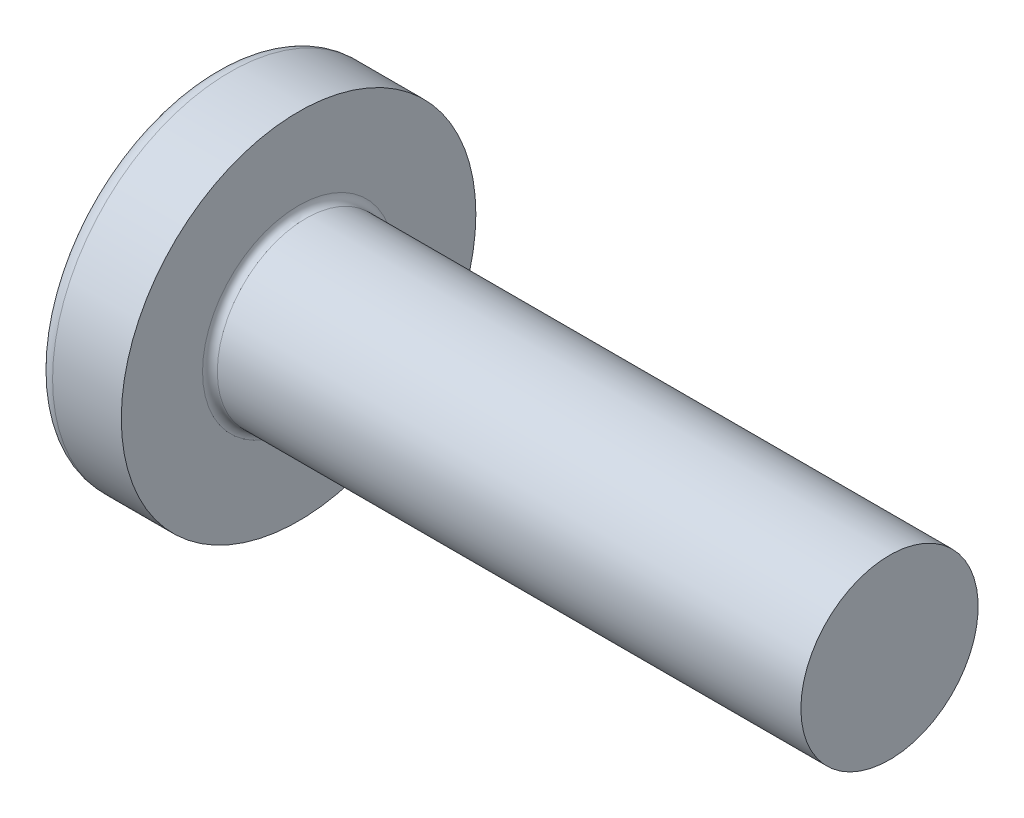
ISO-10303-21;
HEADER;
FILE_DESCRIPTION(('STEP AP214'),'2;1');
FILE_NAME('part.step','',(''),(''),'','','');
FILE_SCHEMA(('AUTOMOTIVE_DESIGN { 1 0 10303 214 1 1 1 1 }'));
ENDSEC;
DATA;
#1=APPLICATION_CONTEXT('core data for automotive mechanical design processes');
#2=APPLICATION_PROTOCOL_DEFINITION('international standard','automotive_design',2000,#1);
#3=PRODUCT_CONTEXT('',#1,'mechanical');
#4=PRODUCT('Part','Part','',(#3));
#5=PRODUCT_RELATED_PRODUCT_CATEGORY('part','',(#4));
#6=PRODUCT_DEFINITION_FORMATION('','',#4);
#7=PRODUCT_DEFINITION_CONTEXT('part definition',#1,'design');
#8=PRODUCT_DEFINITION('design','',#6,#7);
#9=PRODUCT_DEFINITION_SHAPE('','',#8);
#10=(LENGTH_UNIT() NAMED_UNIT(*) SI_UNIT(.MILLI.,.METRE.));
#11=(NAMED_UNIT(*) PLANE_ANGLE_UNIT() SI_UNIT($,.RADIAN.));
#12=(NAMED_UNIT(*) SI_UNIT($,.STERADIAN.) SOLID_ANGLE_UNIT());
#13=UNCERTAINTY_MEASURE_WITH_UNIT(LENGTH_MEASURE(1.E-05),#10,'distance_accuracy_value','');
#14=(GEOMETRIC_REPRESENTATION_CONTEXT(3) GLOBAL_UNCERTAINTY_ASSIGNED_CONTEXT((#13)) GLOBAL_UNIT_ASSIGNED_CONTEXT((#10,
#11,#12)) REPRESENTATION_CONTEXT('',''));
#15=CARTESIAN_POINT('',(0.,0.,0.));
#16=DIRECTION('',(0.,0.,1.));
#17=DIRECTION('',(1.,0.,0.));
#18=AXIS2_PLACEMENT_3D('',#15,#16,#17);
#19=CARTESIAN_POINT('',(10.,0.,0.));
#20=DIRECTION('',(-1.,0.,0.));
#21=DIRECTION('',(0.,1.,0.));
#22=AXIS2_PLACEMENT_3D('',#19,#20,#21);
#23=SPHERICAL_SURFACE('',#22,10.);
#24=CARTESIAN_POINT('',(1.83373872480847,0.,0.));
#25=DIRECTION('',(-1.,0.,0.));
#26=DIRECTION('',(0.,0.,1.));
#27=AXIS2_PLACEMENT_3D('',#24,#25,#26);
#28=CIRCLE('',#27,5.77167019027484);
#29=CARTESIAN_POINT('',(1.83373872480847,0.,5.77167019027484));
#30=VERTEX_POINT('',#29);
#31=EDGE_CURVE('E213',#30,#30,#28,.T.);
#32=ORIENTED_EDGE('',*,*,#31,.T.);
#33=EDGE_LOOP('',(#32));
#34=FACE_BOUND('',#33,.T.);
#35=CARTESIAN_POINT('',(0.11533271177369,0.,0.));
#36=DIRECTION('',(1.,0.,0.));
#37=DIRECTION('',(0.,0.,-1.));
#38=AXIS2_PLACEMENT_3D('',#35,#36,#37);
#39=CIRCLE('',#38,1.51438192047739);
#40=CARTESIAN_POINT('',(0.115332711773695,-0.709999999999995,-1.33762947076864));
#41=VERTEX_POINT('',#40);
#42=CARTESIAN_POINT('',(0.11533271177369,-1.33762947076862,-0.71));
#43=VERTEX_POINT('',#42);
#44=EDGE_CURVE('E339',#41,#43,#39,.F.);
#45=ORIENTED_EDGE('',*,*,#44,.F.);
#46=CARTESIAN_POINT('',(10.,-0.71,0.));
#47=DIRECTION('',(0.,1.,0.));
#48=DIRECTION('',(0.,0.,1.));
#49=AXIS2_PLACEMENT_3D('',#46,#47,#48);
#50=CIRCLE('',#49,9.97476315508293);
#51=CARTESIAN_POINT('',(0.516695966128057,-0.709999999999989,-3.09238493741451));
#52=VERTEX_POINT('',#51);
#53=EDGE_CURVE('E273',#52,#41,#50,.T.);
#54=ORIENTED_EDGE('',*,*,#53,.F.);
#55=CARTESIAN_POINT('',(9.3467899937754,0.,1.3101368059126));
#56=DIRECTION('',(0.446197753347436,0.,-0.894934391398443));
#57=DIRECTION('',(-0.894934391398443,0.,-0.446197753347436));
#58=AXIS2_PLACEMENT_3D('',#55,#56,#57);
#59=CIRCLE('',#58,9.89226254390578);
#60=CARTESIAN_POINT('',(0.516695966128057,0.710000000000011,-3.0923849374145));
#61=VERTEX_POINT('',#60);
#62=EDGE_CURVE('E247',#52,#61,#59,.T.);
#63=ORIENTED_EDGE('',*,*,#62,.T.);
#64=CARTESIAN_POINT('',(10.,0.71,0.));
#65=DIRECTION('',(0.,-1.,0.));
#66=DIRECTION('',(0.,0.,-1.));
#67=AXIS2_PLACEMENT_3D('',#64,#65,#66);
#68=CIRCLE('',#67,9.97476315508293);
#69=CARTESIAN_POINT('',(0.115332711773694,0.710000000000005,-1.33762947076863));
#70=VERTEX_POINT('',#69);
#71=EDGE_CURVE('E301',#70,#61,#68,.T.);
#72=ORIENTED_EDGE('',*,*,#71,.F.);
#73=CARTESIAN_POINT('',(0.11533271177369,1.33762947076862,-0.71));
#74=VERTEX_POINT('',#73);
#75=EDGE_CURVE('E354',#74,#70,#39,.F.);
#76=ORIENTED_EDGE('',*,*,#75,.F.);
#77=CARTESIAN_POINT('',(10.,0.,-0.71));
#78=DIRECTION('',(0.,0.,1.));
#79=DIRECTION('',(1.,0.,0.));
#80=AXIS2_PLACEMENT_3D('',#77,#78,#79);
#81=CIRCLE('',#80,9.97476315508293);
#82=CARTESIAN_POINT('',(0.516695966128057,3.09238493741451,-0.71));
#83=VERTEX_POINT('',#82);
#84=EDGE_CURVE('E241',#83,#74,#81,.T.);
#85=ORIENTED_EDGE('',*,*,#84,.F.);
#86=CARTESIAN_POINT('',(9.3467899937754,-1.3101368059126,0.));
#87=DIRECTION('',(0.446197753347436,0.894934391398443,0.));
#88=DIRECTION('',(-0.894934391398443,0.446197753347436,0.));
#89=AXIS2_PLACEMENT_3D('',#86,#87,#88);
#90=CIRCLE('',#89,9.89226254390578);
#91=CARTESIAN_POINT('',(0.516695966128057,3.09238493741451,0.71));
#92=VERTEX_POINT('',#91);
#93=EDGE_CURVE('E244',#83,#92,#90,.T.);
#94=ORIENTED_EDGE('',*,*,#93,.T.);
#95=CARTESIAN_POINT('',(10.,0.,0.71));
#96=DIRECTION('',(0.,0.,-1.));
#97=DIRECTION('',(0.,1.,0.));
#98=AXIS2_PLACEMENT_3D('',#95,#96,#97);
#99=CIRCLE('',#98,9.97476315508293);
#100=CARTESIAN_POINT('',(0.11533271177369,1.33762947076862,0.71));
#101=VERTEX_POINT('',#100);
#102=EDGE_CURVE('E237',#101,#92,#99,.T.);
#103=ORIENTED_EDGE('',*,*,#102,.F.);
#104=CARTESIAN_POINT('',(0.115332711773695,0.709999999999995,1.33762947076864));
#105=VERTEX_POINT('',#104);
#106=EDGE_CURVE('E353',#105,#101,#39,.F.);
#107=ORIENTED_EDGE('',*,*,#106,.F.);
#108=CARTESIAN_POINT('',(0.516695966128057,0.709999999999989,3.09238493741451));
#109=VERTEX_POINT('',#108);
#110=EDGE_CURVE('E257',#109,#105,#68,.T.);
#111=ORIENTED_EDGE('',*,*,#110,.F.);
#112=CARTESIAN_POINT('',(9.3467899937754,0.,-1.3101368059126));
#113=DIRECTION('',(0.446197753347436,0.,0.894934391398443));
#114=DIRECTION('',(0.894934391398443,0.,-0.446197753347436));
#115=AXIS2_PLACEMENT_3D('',#112,#113,#114);
#116=CIRCLE('',#115,9.89226254390578);
#117=CARTESIAN_POINT('',(0.516695966128057,-0.710000000000011,3.0923849374145));
#118=VERTEX_POINT('',#117);
#119=EDGE_CURVE('E48',#109,#118,#116,.T.);
#120=ORIENTED_EDGE('',*,*,#119,.T.);
#121=CARTESIAN_POINT('',(0.115332711773694,-0.710000000000005,1.33762947076863));
#122=VERTEX_POINT('',#121);
#123=EDGE_CURVE('E254',#122,#118,#50,.T.);
#124=ORIENTED_EDGE('',*,*,#123,.F.);
#125=CARTESIAN_POINT('',(0.11533271177369,-1.33762947076862,0.709999999999999));
#126=VERTEX_POINT('',#125);
#127=EDGE_CURVE('E385',#126,#122,#39,.F.);
#128=ORIENTED_EDGE('',*,*,#127,.F.);
#129=CARTESIAN_POINT('',(0.516695966128057,-3.0923849374145,0.709999999999999));
#130=VERTEX_POINT('',#129);
#131=EDGE_CURVE('E238',#130,#126,#99,.T.);
#132=ORIENTED_EDGE('',*,*,#131,.F.);
#133=CARTESIAN_POINT('',(9.3467899937754,1.3101368059126,0.));
#134=DIRECTION('',(0.446197753347436,-0.894934391398443,0.));
#135=DIRECTION('',(0.894934391398443,0.446197753347436,0.));
#136=AXIS2_PLACEMENT_3D('',#133,#134,#135);
#137=CIRCLE('',#136,9.89226254390578);
#138=CARTESIAN_POINT('',(0.516695966128057,-3.09238493741451,-0.71));
#139=VERTEX_POINT('',#138);
#140=EDGE_CURVE('E234',#130,#139,#137,.T.);
#141=ORIENTED_EDGE('',*,*,#140,.T.);
#142=EDGE_CURVE('E63',#43,#139,#81,.T.);
#143=ORIENTED_EDGE('',*,*,#142,.F.);
#144=EDGE_LOOP('',(#45,#54,#63,#72,#76,#85,#94,#103,#107,#111,#120,#124,#128,#132,#141,#143));
#145=FACE_BOUND('',#144,.T.);
#146=ADVANCED_FACE('F35',(#34,#145),#23,.T.);
#147=CARTESIAN_POINT('',(3.46,1.62490792462486,-0.71));
#148=DIRECTION('',(0.,0.,1.));
#149=DIRECTION('',(1.,0.,0.));
#150=AXIS2_PLACEMENT_3D('',#147,#148,#149);
#151=PLANE('',#150);
#152=ORIENTED_EDGE('',*,*,#84,.T.);
#153=CARTESIAN_POINT('',(-2.28089704213722,1.52473965101837,-0.71));
#154=CARTESIAN_POINT('',(-1.81861622822998,1.48907386498352,-0.71));
#155=CARTESIAN_POINT('',(-1.35635131302274,1.45320000395987,-0.71));
#156=CARTESIAN_POINT('',(-0.431857761667543,1.3808964085712,-0.71));
#157=CARTESIAN_POINT('',(0.0303708738054363,1.34446666558133,-0.71));
#158=CARTESIAN_POINT('',(0.954772750089382,1.27091270389059,-0.71));
#159=CARTESIAN_POINT('',(1.41694599093296,1.23378848560061,-0.71));
#160=CARTESIAN_POINT('',(2.1101468655661,1.17741958304234,-0.71));
#161=CARTESIAN_POINT('',(2.34120225142472,1.15851633138213,-0.71));
#162=CARTESIAN_POINT('',(2.80329254149198,1.12044387603508,-0.71));
#163=CARTESIAN_POINT('',(3.03432744556048,1.10127467065167,-0.71));
#164=CARTESIAN_POINT('',(3.81376951672291,1.03608826026628,-0.71));
#165=CARTESIAN_POINT('',(4.3621185642133,0.989367924506424,-0.71));
#166=CARTESIAN_POINT('',(5.18446393534975,0.917336183170652,-0.71));
#167=CARTESIAN_POINT('',(5.45854573527601,0.893000731200899,-0.71));
#168=CARTESIAN_POINT('',(6.00663594033703,0.843493254998865,-0.71));
#169=CARTESIAN_POINT('',(6.28064434495887,0.818321225066341,-0.71));
#170=CARTESIAN_POINT('',(6.82859287274618,0.766879824151132,-0.71));
#171=CARTESIAN_POINT('',(7.10253298312854,0.740610316661091,-0.71));
#172=CARTESIAN_POINT('',(7.65026285025565,0.686585019837831,-0.71));
#173=CARTESIAN_POINT('',(7.92405260972714,0.658829258423122,-0.71));
#174=CARTESIAN_POINT('',(8.33458184018721,0.615573696383427,-0.71));
#175=CARTESIAN_POINT('',(8.4714065534312,0.600884001267348,-0.71));
#176=CARTESIAN_POINT('',(8.74498055470476,0.570826220799602,-0.71));
#177=CARTESIAN_POINT('',(8.88172984329827,0.555458140591717,-0.71));
#178=CARTESIAN_POINT('',(9.15513948220117,0.523868434617907,-0.71));
#179=CARTESIAN_POINT('',(9.29179982631774,0.507646754763106,-0.71));
#180=CARTESIAN_POINT('',(9.56498051884117,0.474039680066355,-0.71));
#181=CARTESIAN_POINT('',(9.70150086350508,0.45665425489429,-0.71));
#182=CARTESIAN_POINT('',(9.83792645731126,0.438531836217977,-0.71));
#183=B_SPLINE_CURVE_WITH_KNOTS('',3,(#153,#154,#155,#156,#157,#158,#159,#160,#161,#162,#163,
#164,#165,#166,#167,#168,#169,#170,#171,#172,#173,#174,#175,#176,#177,#178,#179,#180,#181,#182),
.UNSPECIFIED.,.F.,.F.,(4,2,2,2,2,2,2,2,2,2,2,2,2,2,4),(0.,1.39096401174475,2.78194962715189,
4.17293441960638,4.86841633218882,5.56390268344286,7.21490482310267,8.04038405799492,
8.86586891866053,9.69145676295231,10.5170291044415,10.9298607906012,11.3426893470464,
11.7555440942062,12.1684096055867),.UNSPECIFIED.);
#184=CARTESIAN_POINT('',(3.46,1.06563607765503,-0.710000000000001));
#185=VERTEX_POINT('',#184);
#186=EDGE_CURVE('E374',#74,#185,#183,.T.);
#187=ORIENTED_EDGE('',*,*,#186,.T.);
#188=DIRECTION('',(0.,1.,0.));
#189=VECTOR('',#188,1.);
#190=CARTESIAN_POINT('',(3.46,-1.62490792462486,-0.71));
#191=LINE('',#190,#189);
#192=CARTESIAN_POINT('',(3.46,1.62490792462486,-0.71));
#193=VERTEX_POINT('',#192);
#194=EDGE_CURVE('E322',#185,#193,#191,.T.);
#195=ORIENTED_EDGE('',*,*,#194,.T.);
#196=DIRECTION('',(0.894934391398442,-0.446197753347436,0.));
#197=VECTOR('',#196,1.);
#198=CARTESIAN_POINT('',(0.,3.35,-0.71));
#199=LINE('',#198,#197);
#200=EDGE_CURVE('E214',#83,#193,#199,.T.);
#201=ORIENTED_EDGE('',*,*,#200,.F.);
#202=EDGE_LOOP('',(#152,#187,#195,#201));
#203=FACE_BOUND('',#202,.T.);
#204=ADVANCED_FACE('F169',(#203),#151,.T.);
#205=CARTESIAN_POINT('',(3.46,-1.62490792462486,-0.71));
#206=VERTEX_POINT('',#205);
#207=CARTESIAN_POINT('',(3.46,-1.06563607765503,-0.710000000000001));
#208=VERTEX_POINT('',#207);
#209=EDGE_CURVE('E222',#206,#208,#191,.T.);
#210=ORIENTED_EDGE('',*,*,#209,.T.);
#211=CARTESIAN_POINT('',(-2.28089704213722,-1.52473965101837,-0.71));
#212=CARTESIAN_POINT('',(-1.81861622822998,-1.48907386498352,-0.71));
#213=CARTESIAN_POINT('',(-1.35635131302274,-1.45320000395987,-0.71));
#214=CARTESIAN_POINT('',(-0.431857761667543,-1.3808964085712,-0.71));
#215=CARTESIAN_POINT('',(0.0303708738054364,-1.34446666558133,-0.71));
#216=CARTESIAN_POINT('',(0.954772750089383,-1.27091270389059,-0.71));
#217=CARTESIAN_POINT('',(1.41694599093296,-1.23378848560061,-0.71));
#218=CARTESIAN_POINT('',(2.1101468655661,-1.17741958304234,-0.71));
#219=CARTESIAN_POINT('',(2.34120225142472,-1.15851633138213,-0.71));
#220=CARTESIAN_POINT('',(2.80329254149198,-1.12044387603508,-0.71));
#221=CARTESIAN_POINT('',(3.03432744556048,-1.10127467065167,-0.71));
#222=CARTESIAN_POINT('',(3.81376951672291,-1.03608826026628,-0.71));
#223=CARTESIAN_POINT('',(4.3621185642133,-0.989367924506424,-0.71));
#224=CARTESIAN_POINT('',(5.18446393534975,-0.917336183170652,-0.71));
#225=CARTESIAN_POINT('',(5.45854573527601,-0.893000731200899,-0.71));
#226=CARTESIAN_POINT('',(6.00663594033703,-0.843493254998865,-0.71));
#227=CARTESIAN_POINT('',(6.28064434495887,-0.818321225066341,-0.71));
#228=CARTESIAN_POINT('',(6.82859287274618,-0.766879824151132,-0.71));
#229=CARTESIAN_POINT('',(7.10253298312854,-0.740610316661091,-0.71));
#230=CARTESIAN_POINT('',(7.65026285025565,-0.686585019837831,-0.71));
#231=CARTESIAN_POINT('',(7.92405260972714,-0.658829258423122,-0.71));
#232=CARTESIAN_POINT('',(8.33458184018721,-0.615573696383427,-0.71));
#233=CARTESIAN_POINT('',(8.4714065534312,-0.600884001267348,-0.71));
#234=CARTESIAN_POINT('',(8.74498055470476,-0.570826220799602,-0.71));
#235=CARTESIAN_POINT('',(8.88172984329826,-0.555458140591717,-0.71));
#236=CARTESIAN_POINT('',(9.15513948220117,-0.523868434617907,-0.71));
#237=CARTESIAN_POINT('',(9.29179982631774,-0.507646754763106,-0.71));
#238=CARTESIAN_POINT('',(9.56498051884117,-0.474039680066355,-0.71));
#239=CARTESIAN_POINT('',(9.70150086350508,-0.456654254894289,-0.71));
#240=CARTESIAN_POINT('',(9.83792645731126,-0.438531836217976,-0.71));
#241=B_SPLINE_CURVE_WITH_KNOTS('',3,(#211,#212,#213,#214,#215,#216,#217,#218,#219,#220,#221,
#222,#223,#224,#225,#226,#227,#228,#229,#230,#231,#232,#233,#234,#235,#236,#237,#238,#239,#240),
.UNSPECIFIED.,.F.,.F.,(4,2,2,2,2,2,2,2,2,2,2,2,2,2,4),(0.,1.39096401174475,2.78194962715189,
4.17293441960638,4.86841633218882,5.56390268344286,7.21490482310267,8.04038405799492,
8.86586891866053,9.69145676295231,10.5170291044415,10.9298607906012,11.3426893470464,
11.7555440942062,12.1684096055867),.UNSPECIFIED.);
#242=EDGE_CURVE('E352',#208,#43,#241,.F.);
#243=ORIENTED_EDGE('',*,*,#242,.T.);
#244=ORIENTED_EDGE('',*,*,#142,.T.);
#245=DIRECTION('',(0.894934391398442,0.446197753347436,0.));
#246=VECTOR('',#245,1.);
#247=CARTESIAN_POINT('',(0.,-3.35,-0.71));
#248=LINE('',#247,#246);
#249=EDGE_CURVE('E304',#139,#206,#248,.T.);
#250=ORIENTED_EDGE('',*,*,#249,.T.);
#251=EDGE_LOOP('',(#210,#243,#244,#250));
#252=FACE_BOUND('',#251,.T.);
#253=ADVANCED_FACE('F175',(#252),#151,.T.);
#254=CARTESIAN_POINT('',(3.46,-1.62490792462486,0.71));
#255=DIRECTION('',(0.,0.,-1.));
#256=DIRECTION('',(0.,1.,0.));
#257=AXIS2_PLACEMENT_3D('',#254,#255,#256);
#258=PLANE('',#257);
#259=DIRECTION('',(0.,-1.,0.));
#260=VECTOR('',#259,1.);
#261=CARTESIAN_POINT('',(3.46,1.62490792462486,0.71));
#262=LINE('',#261,#260);
#263=CARTESIAN_POINT('',(3.46,1.62490792462486,0.71));
#264=VERTEX_POINT('',#263);
#265=CARTESIAN_POINT('',(3.46,1.06563607765503,0.710000000000001));
#266=VERTEX_POINT('',#265);
#267=EDGE_CURVE('E312',#264,#266,#262,.T.);
#268=ORIENTED_EDGE('',*,*,#267,.T.);
#269=CARTESIAN_POINT('',(-2.28089705027091,1.52473965164577,0.71));
#270=CARTESIAN_POINT('',(-1.81861623532717,1.48907386553353,0.71));
#271=CARTESIAN_POINT('',(-1.35635131908348,1.45320000443187,0.71));
#272=CARTESIAN_POINT('',(-0.431857765655442,1.38089640888514,0.71));
#273=CARTESIAN_POINT('',(0.0303708708539246,1.3444666658152,0.71));
#274=CARTESIAN_POINT('',(0.954772749881989,1.27091270390807,0.71));
#275=CARTESIAN_POINT('',(1.41694599243322,1.23378848548075,0.71));
#276=CARTESIAN_POINT('',(2.11014686962733,1.17741958271103,0.71));
#277=CARTESIAN_POINT('',(2.3412022563395,1.15851633097942,0.71));
#278=CARTESIAN_POINT('',(2.80329254811369,1.12044387548729,0.71));
#279=CARTESIAN_POINT('',(3.03432745303557,1.10127467003019,0.71));
#280=CARTESIAN_POINT('',(3.8137695250509,1.03608825956087,0.71));
#281=CARTESIAN_POINT('',(4.36211857254078,0.989367923790553,0.71));
#282=CARTESIAN_POINT('',(5.18446394367596,0.917336182434635,0.71));
#283=CARTESIAN_POINT('',(5.45854574360168,0.893000730457427,0.71));
#284=CARTESIAN_POINT('',(6.00663594866142,0.843493254238334,0.71));
#285=CARTESIAN_POINT('',(6.28064435328252,0.818321224296205,0.71));
#286=CARTESIAN_POINT('',(6.82859288106827,0.766879823358567,0.71));
#287=CARTESIAN_POINT('',(7.1025329914498,0.7406103158557,0.71));
#288=CARTESIAN_POINT('',(7.65026285857465,0.686585019001786,0.71));
#289=CARTESIAN_POINT('',(7.92405261804469,0.658829257569248,0.71));
#290=CARTESIAN_POINT('',(8.3345818485019,0.61557369549618,0.71));
#291=CARTESIAN_POINT('',(8.47140656174489,0.600884000367865,0.71));
#292=CARTESIAN_POINT('',(8.74498056301602,0.570826219872502,0.71));
#293=CARTESIAN_POINT('',(8.8817298516081,0.555458139649238,0.71));
#294=CARTESIAN_POINT('',(9.15513949050765,0.523868433640255,0.71));
#295=CARTESIAN_POINT('',(9.29179983462227,0.50764675376566,0.71));
#296=CARTESIAN_POINT('',(9.56498052714077,0.474039679022048,0.71));
#297=CARTESIAN_POINT('',(9.70150087180168,0.456654253822914,0.71));
#298=CARTESIAN_POINT('',(9.83792646560407,0.438531835114465,0.71));
#299=B_SPLINE_CURVE_WITH_KNOTS('',3,(#269,#270,#271,#272,#273,#274,#275,#276,#277,#278,#279,
#280,#281,#282,#283,#284,#285,#286,#287,#288,#289,#290,#291,#292,#293,#294,#295,#296,#297,#298),
.UNSPECIFIED.,.F.,.F.,(4,2,2,2,2,2,2,2,2,2,2,2,2,2,4),(0.,1.39096401486289,2.78194963338846,
4.17293443098243,4.86841634613445,5.56390269995814,7.21490483961907,8.04038407451168,
8.86586893517771,9.69145677947068,10.5170291209609,10.9298608071215,11.3426893635676,
11.7555441107285,12.1684096221104),.UNSPECIFIED.);
#300=EDGE_CURVE('E278',#266,#101,#299,.F.);
#301=ORIENTED_EDGE('',*,*,#300,.T.);
#302=ORIENTED_EDGE('',*,*,#102,.T.);
#303=DIRECTION('',(0.894934391398442,-0.446197753347436,0.));
#304=VECTOR('',#303,1.);
#305=CARTESIAN_POINT('',(0.,3.35,0.71));
#306=LINE('',#305,#304);
#307=EDGE_CURVE('E219',#92,#264,#306,.T.);
#308=ORIENTED_EDGE('',*,*,#307,.T.);
#309=EDGE_LOOP('',(#268,#301,#302,#308));
#310=FACE_BOUND('',#309,.T.);
#311=ADVANCED_FACE('F370',(#310),#258,.T.);
#312=ORIENTED_EDGE('',*,*,#131,.T.);
#313=CARTESIAN_POINT('',(-2.28089704213722,-1.52473965101837,0.71));
#314=CARTESIAN_POINT('',(-1.81861622822998,-1.48907386498352,0.71));
#315=CARTESIAN_POINT('',(-1.35635131302274,-1.45320000395987,0.71));
#316=CARTESIAN_POINT('',(-0.431857761667543,-1.3808964085712,0.71));
#317=CARTESIAN_POINT('',(0.0303708738054362,-1.34446666558133,0.71));
#318=CARTESIAN_POINT('',(0.954772750089382,-1.27091270389059,0.71));
#319=CARTESIAN_POINT('',(1.41694599093296,-1.23378848560061,0.71));
#320=CARTESIAN_POINT('',(2.1101468655661,-1.17741958304234,0.71));
#321=CARTESIAN_POINT('',(2.34120225142472,-1.15851633138213,0.71));
#322=CARTESIAN_POINT('',(2.80329254149198,-1.12044387603508,0.71));
#323=CARTESIAN_POINT('',(3.03432744556048,-1.10127467065167,0.71));
#324=CARTESIAN_POINT('',(3.81376951672291,-1.03608826026628,0.71));
#325=CARTESIAN_POINT('',(4.3621185642133,-0.989367924506424,0.71));
#326=CARTESIAN_POINT('',(5.18446393534975,-0.917336183170652,0.71));
#327=CARTESIAN_POINT('',(5.45854573527601,-0.893000731200899,0.71));
#328=CARTESIAN_POINT('',(6.00663594033703,-0.843493254998865,0.71));
#329=CARTESIAN_POINT('',(6.28064434495887,-0.818321225066341,0.71));
#330=CARTESIAN_POINT('',(6.82859287274618,-0.766879824151132,0.71));
#331=CARTESIAN_POINT('',(7.10253298312854,-0.740610316661091,0.71));
#332=CARTESIAN_POINT('',(7.65026285025566,-0.686585019837831,0.71));
#333=CARTESIAN_POINT('',(7.92405260972714,-0.658829258423122,0.71));
#334=CARTESIAN_POINT('',(8.33458184018721,-0.615573696383427,0.71));
#335=CARTESIAN_POINT('',(8.4714065534312,-0.600884001267348,0.71));
#336=CARTESIAN_POINT('',(8.74498055470476,-0.570826220799602,0.71));
#337=CARTESIAN_POINT('',(8.88172984329826,-0.555458140591717,0.71));
#338=CARTESIAN_POINT('',(9.15513948220117,-0.523868434617907,0.71));
#339=CARTESIAN_POINT('',(9.29179982631774,-0.507646754763106,0.71));
#340=CARTESIAN_POINT('',(9.56498051884117,-0.474039680066355,0.71));
#341=CARTESIAN_POINT('',(9.70150086350508,-0.456654254894289,0.71));
#342=CARTESIAN_POINT('',(9.83792645731126,-0.438531836217976,0.71));
#343=B_SPLINE_CURVE_WITH_KNOTS('',3,(#313,#314,#315,#316,#317,#318,#319,#320,#321,#322,#323,
#324,#325,#326,#327,#328,#329,#330,#331,#332,#333,#334,#335,#336,#337,#338,#339,#340,#341,#342),
.UNSPECIFIED.,.F.,.F.,(4,2,2,2,2,2,2,2,2,2,2,2,2,2,4),(0.,1.39096401174475,2.78194962715189,
4.17293441960638,4.86841633218882,5.56390268344286,7.21490482310267,8.04038405799493,
8.86586891866053,9.69145676295231,10.5170291044415,10.9298607906012,11.3426893470464,
11.7555440942062,12.1684096055867),.UNSPECIFIED.);
#344=CARTESIAN_POINT('',(3.46,-1.06563607765503,0.710000000000001));
#345=VERTEX_POINT('',#344);
#346=EDGE_CURVE('E386',#126,#345,#343,.T.);
#347=ORIENTED_EDGE('',*,*,#346,.T.);
#348=CARTESIAN_POINT('',(3.46,-1.62490792462486,0.71));
#349=VERTEX_POINT('',#348);
#350=EDGE_CURVE('E314',#345,#349,#262,.T.);
#351=ORIENTED_EDGE('',*,*,#350,.T.);
#352=DIRECTION('',(0.894934391398442,0.446197753347436,0.));
#353=VECTOR('',#352,1.);
#354=CARTESIAN_POINT('',(0.,-3.35,0.709999999999999));
#355=LINE('',#354,#353);
#356=EDGE_CURVE('E306',#130,#349,#355,.T.);
#357=ORIENTED_EDGE('',*,*,#356,.F.);
#358=EDGE_LOOP('',(#312,#347,#351,#357));
#359=FACE_BOUND('',#358,.T.);
#360=ADVANCED_FACE('F415',(#359),#258,.T.);
#361=CARTESIAN_POINT('',(3.46,1.62490792462486,-0.709999999999999));
#362=DIRECTION('',(-1.,0.,0.));
#363=DIRECTION('',(0.,0.,1.));
#364=AXIS2_PLACEMENT_3D('',#361,#362,#363);
#365=PLANE('',#364);
#366=ORIENTED_EDGE('',*,*,#350,.F.);
#367=CARTESIAN_POINT('',(3.46,0.,0.));
#368=DIRECTION('',(-1.,0.,0.));
#369=DIRECTION('',(0.,0.,1.));
#370=AXIS2_PLACEMENT_3D('',#367,#368,#369);
#371=CIRCLE('',#370,1.2805);
#372=EDGE_CURVE('E347',#208,#345,#371,.T.);
#373=ORIENTED_EDGE('',*,*,#372,.F.);
#374=ORIENTED_EDGE('',*,*,#209,.F.);
#375=DIRECTION('',(0.,0.,1.));
#376=VECTOR('',#375,1.);
#377=CARTESIAN_POINT('',(3.46,-1.62490792462486,-0.71));
#378=LINE('',#377,#376);
#379=EDGE_CURVE('E309',#206,#349,#378,.T.);
#380=ORIENTED_EDGE('',*,*,#379,.T.);
#381=EDGE_LOOP('',(#366,#373,#374,#380));
#382=FACE_BOUND('',#381,.T.);
#383=ADVANCED_FACE('F408',(#382),#365,.T.);
#384=DIRECTION('',(0.,0.,-1.));
#385=VECTOR('',#384,1.);
#386=CARTESIAN_POINT('',(3.46,-0.710000000000006,1.62490792462486));
#387=LINE('',#386,#385);
#388=CARTESIAN_POINT('',(3.46,-0.709999999999996,-1.06563607765503));
#389=VERTEX_POINT('',#388);
#390=CARTESIAN_POINT('',(3.46,-0.709999999999994,-1.62490792462486));
#391=VERTEX_POINT('',#390);
#392=EDGE_CURVE('E295',#389,#391,#387,.T.);
#393=ORIENTED_EDGE('',*,*,#392,.F.);
#394=CARTESIAN_POINT('',(3.46,0.710000000000004,-1.06563607765503));
#395=VERTEX_POINT('',#394);
#396=EDGE_CURVE('E55',#395,#389,#371,.T.);
#397=ORIENTED_EDGE('',*,*,#396,.F.);
#398=DIRECTION('',(0.,0.,1.));
#399=VECTOR('',#398,1.);
#400=CARTESIAN_POINT('',(3.46,0.710000000000006,-1.62490792462486));
#401=LINE('',#400,#399);
#402=CARTESIAN_POINT('',(3.46,0.710000000000006,-1.62490792462486));
#403=VERTEX_POINT('',#402);
#404=EDGE_CURVE('E298',#403,#395,#401,.T.);
#405=ORIENTED_EDGE('',*,*,#404,.F.);
#406=DIRECTION('',(0.,-1.,0.));
#407=VECTOR('',#406,1.);
#408=CARTESIAN_POINT('',(3.46,0.710000000000006,-1.62490792462486));
#409=LINE('',#408,#407);
#410=EDGE_CURVE('E289',#403,#391,#409,.T.);
#411=ORIENTED_EDGE('',*,*,#410,.T.);
#412=EDGE_LOOP('',(#393,#397,#405,#411));
#413=FACE_BOUND('',#412,.T.);
#414=ADVANCED_FACE('F342',(#413),#365,.T.);
#415=ORIENTED_EDGE('',*,*,#194,.F.);
#416=EDGE_CURVE('E346',#266,#185,#371,.T.);
#417=ORIENTED_EDGE('',*,*,#416,.F.);
#418=ORIENTED_EDGE('',*,*,#267,.F.);
#419=DIRECTION('',(0.,0.,-1.));
#420=VECTOR('',#419,1.);
#421=CARTESIAN_POINT('',(3.46,1.62490792462486,0.71));
#422=LINE('',#421,#420);
#423=EDGE_CURVE('E315',#264,#193,#422,.T.);
#424=ORIENTED_EDGE('',*,*,#423,.T.);
#425=EDGE_LOOP('',(#415,#417,#418,#424));
#426=FACE_BOUND('',#425,.T.);
#427=ADVANCED_FACE('F409',(#426),#365,.T.);
#428=CARTESIAN_POINT('',(3.46,0.709999999999994,1.62490792462486));
#429=DIRECTION('',(0.,-1.,0.));
#430=DIRECTION('',(1.,0.,0.));
#431=AXIS2_PLACEMENT_3D('',#428,#429,#430);
#432=PLANE('',#431);
#433=ORIENTED_EDGE('',*,*,#110,.T.);
#434=CARTESIAN_POINT('',(-2.28089704213722,0.709999999999995,1.52473965101837));
#435=CARTESIAN_POINT('',(-1.81861622822998,0.709999999999995,1.48907386498352));
#436=CARTESIAN_POINT('',(-1.35635131302274,0.709999999999995,1.45320000395987));
#437=CARTESIAN_POINT('',(-0.431857761667543,0.709999999999995,1.38089640857121));
#438=CARTESIAN_POINT('',(0.0303708738054362,0.709999999999995,1.34446666558134));
#439=CARTESIAN_POINT('',(0.954772750089383,0.709999999999995,1.2709127038906));
#440=CARTESIAN_POINT('',(1.41694599093296,0.709999999999996,1.23378848560061));
#441=CARTESIAN_POINT('',(2.1101468655661,0.709999999999996,1.17741958304234));
#442=CARTESIAN_POINT('',(2.34120225142472,0.709999999999996,1.15851633138213));
#443=CARTESIAN_POINT('',(2.80329254149198,0.709999999999996,1.12044387603508));
#444=CARTESIAN_POINT('',(3.03432744556048,0.709999999999996,1.10127467065167));
#445=CARTESIAN_POINT('',(3.81376951672291,0.709999999999996,1.03608826026628));
#446=CARTESIAN_POINT('',(4.3621185642133,0.709999999999997,0.989367924506427));
#447=CARTESIAN_POINT('',(5.18446393534975,0.709999999999997,0.917336183170655));
#448=CARTESIAN_POINT('',(5.45854573527601,0.709999999999997,0.893000731200901));
#449=CARTESIAN_POINT('',(6.00663594033703,0.709999999999997,0.843493254998868));
#450=CARTESIAN_POINT('',(6.28064434495887,0.709999999999997,0.818321225066344));
#451=CARTESIAN_POINT('',(6.82859287274618,0.709999999999997,0.766879824151135));
#452=CARTESIAN_POINT('',(7.10253298312854,0.709999999999997,0.740610316661093));
#453=CARTESIAN_POINT('',(7.65026285025565,0.709999999999998,0.686585019837834));
#454=CARTESIAN_POINT('',(7.92405260972714,0.709999999999998,0.658829258423125));
#455=CARTESIAN_POINT('',(8.33458184018721,0.709999999999998,0.615573696383429));
#456=CARTESIAN_POINT('',(8.4714065534312,0.709999999999998,0.600884001267351));
#457=CARTESIAN_POINT('',(8.74498055470475,0.709999999999998,0.570826220799605));
#458=CARTESIAN_POINT('',(8.88172984329826,0.709999999999998,0.55545814059172));
#459=CARTESIAN_POINT('',(9.15513948220117,0.709999999999998,0.52386843461791));
#460=CARTESIAN_POINT('',(9.29179982631774,0.709999999999998,0.507646754763109));
#461=CARTESIAN_POINT('',(9.56498051884117,0.709999999999998,0.474039680066358));
#462=CARTESIAN_POINT('',(9.70150086350508,0.709999999999998,0.456654254894292));
#463=CARTESIAN_POINT('',(9.83792645731126,0.709999999999998,0.438531836217979));
#464=B_SPLINE_CURVE_WITH_KNOTS('',3,(#434,#435,#436,#437,#438,#439,#440,#441,#442,#443,#444,
#445,#446,#447,#448,#449,#450,#451,#452,#453,#454,#455,#456,#457,#458,#459,#460,#461,#462,#463),
.UNSPECIFIED.,.F.,.F.,(4,2,2,2,2,2,2,2,2,2,2,2,2,2,4),(0.,1.39096401174475,2.78194962715189,
4.17293441960638,4.86841633218882,5.56390268344286,7.21490482310267,8.04038405799492,
8.86586891866053,9.6914567629523,10.5170291044415,10.9298607906012,11.3426893470464,
11.7555440942062,12.1684096055867),.UNSPECIFIED.);
#465=CARTESIAN_POINT('',(3.46,0.709999999999996,1.06563607765503));
#466=VERTEX_POINT('',#465);
#467=EDGE_CURVE('E433',#105,#466,#464,.T.);
#468=ORIENTED_EDGE('',*,*,#467,.T.);
#469=CARTESIAN_POINT('',(3.46,0.709999999999994,1.62490792462486));
#470=VERTEX_POINT('',#469);
#471=EDGE_CURVE('E271',#466,#470,#401,.T.);
#472=ORIENTED_EDGE('',*,*,#471,.T.);
#473=DIRECTION('',(0.894934391398442,0.,-0.446197753347436));
#474=VECTOR('',#473,1.);
#475=CARTESIAN_POINT('',(0.,0.709999999999988,3.35));
#476=LINE('',#475,#474);
#477=EDGE_CURVE('E264',#109,#470,#476,.T.);
#478=ORIENTED_EDGE('',*,*,#477,.F.);
#479=EDGE_LOOP('',(#433,#468,#472,#478));
#480=FACE_BOUND('',#479,.T.);
#481=ADVANCED_FACE('F268',(#480),#432,.T.);
#482=CARTESIAN_POINT('',(3.46,-0.709999999999994,-1.62490792462486));
#483=DIRECTION('',(0.,1.,0.));
#484=DIRECTION('',(0.,0.,1.));
#485=AXIS2_PLACEMENT_3D('',#482,#483,#484);
#486=PLANE('',#485);
#487=CARTESIAN_POINT('',(3.46,-0.710000000000006,1.62490792462486));
#488=VERTEX_POINT('',#487);
#489=CARTESIAN_POINT('',(3.46,-0.710000000000004,1.06563607765503));
#490=VERTEX_POINT('',#489);
#491=EDGE_CURVE('E292',#488,#490,#387,.T.);
#492=ORIENTED_EDGE('',*,*,#491,.T.);
#493=CARTESIAN_POINT('',(-2.28089705027091,-0.710000000000005,1.52473965164577));
#494=CARTESIAN_POINT('',(-1.81861623532717,-0.710000000000005,1.48907386553353));
#495=CARTESIAN_POINT('',(-1.35635131908348,-0.710000000000005,1.45320000443187));
#496=CARTESIAN_POINT('',(-0.431857765655443,-0.710000000000005,1.38089640888513));
#497=CARTESIAN_POINT('',(0.030370870853924,-0.710000000000005,1.3444666658152));
#498=CARTESIAN_POINT('',(0.954772749881989,-0.710000000000004,1.27091270390807));
#499=CARTESIAN_POINT('',(1.41694599243322,-0.710000000000004,1.23378848548075));
#500=CARTESIAN_POINT('',(2.11014686962733,-0.710000000000004,1.17741958271102));
#501=CARTESIAN_POINT('',(2.3412022563395,-0.710000000000004,1.15851633097942));
#502=CARTESIAN_POINT('',(2.80329254811369,-0.710000000000004,1.12044387548729));
#503=CARTESIAN_POINT('',(3.03432745303557,-0.710000000000004,1.10127467003019));
#504=CARTESIAN_POINT('',(3.81376952505089,-0.710000000000004,1.03608825956087));
#505=CARTESIAN_POINT('',(4.36211857254078,-0.710000000000004,0.989367923790551));
#506=CARTESIAN_POINT('',(5.18446394367596,-0.710000000000003,0.917336182434633));
#507=CARTESIAN_POINT('',(5.45854574360167,-0.710000000000003,0.893000730457425));
#508=CARTESIAN_POINT('',(6.00663594866141,-0.710000000000003,0.843493254238332));
#509=CARTESIAN_POINT('',(6.28064435328251,-0.710000000000003,0.818321224296203));
#510=CARTESIAN_POINT('',(6.82859288106826,-0.710000000000003,0.766879823358565));
#511=CARTESIAN_POINT('',(7.1025329914498,-0.710000000000003,0.740610315855698));
#512=CARTESIAN_POINT('',(7.65026285857464,-0.710000000000003,0.686585019001784));
#513=CARTESIAN_POINT('',(7.92405261804469,-0.710000000000003,0.658829257569246));
#514=CARTESIAN_POINT('',(8.33458184850189,-0.710000000000002,0.615573695496179));
#515=CARTESIAN_POINT('',(8.47140656174489,-0.710000000000002,0.600884000367863));
#516=CARTESIAN_POINT('',(8.74498056301602,-0.710000000000002,0.5708262198725));
#517=CARTESIAN_POINT('',(8.8817298516081,-0.710000000000002,0.555458139649236));
#518=CARTESIAN_POINT('',(9.15513949050764,-0.710000000000002,0.523868433640253));
#519=CARTESIAN_POINT('',(9.29179983462226,-0.710000000000002,0.507646753765658));
#520=CARTESIAN_POINT('',(9.56498052714076,-0.710000000000002,0.474039679022046));
#521=CARTESIAN_POINT('',(9.70150087180168,-0.710000000000002,0.456654253822912));
#522=CARTESIAN_POINT('',(9.83792646560407,-0.710000000000002,0.438531835114463));
#523=B_SPLINE_CURVE_WITH_KNOTS('',3,(#493,#494,#495,#496,#497,#498,#499,#500,#501,#502,#503,
#504,#505,#506,#507,#508,#509,#510,#511,#512,#513,#514,#515,#516,#517,#518,#519,#520,#521,#522),
.UNSPECIFIED.,.F.,.F.,(4,2,2,2,2,2,2,2,2,2,2,2,2,2,4),(0.,1.39096401486289,2.78194963338846,
4.17293443098243,4.86841634613445,5.56390269995814,7.21490483961907,8.04038407451168,
8.8658689351777,9.69145677947067,10.5170291209609,10.9298608071215,11.3426893635676,
11.7555441107285,12.1684096221104),.UNSPECIFIED.);
#524=EDGE_CURVE('E379',#490,#122,#523,.F.);
#525=ORIENTED_EDGE('',*,*,#524,.T.);
#526=ORIENTED_EDGE('',*,*,#123,.T.);
#527=DIRECTION('',(0.894934391398442,0.,-0.446197753347436));
#528=VECTOR('',#527,1.);
#529=CARTESIAN_POINT('',(0.,-0.710000000000012,3.35));
#530=LINE('',#529,#528);
#531=EDGE_CURVE('E266',#118,#488,#530,.T.);
#532=ORIENTED_EDGE('',*,*,#531,.T.);
#533=EDGE_LOOP('',(#492,#525,#526,#532));
#534=FACE_BOUND('',#533,.T.);
#535=ADVANCED_FACE('F204',(#534),#486,.T.);
#536=ORIENTED_EDGE('',*,*,#404,.T.);
#537=CARTESIAN_POINT('',(-2.28089704213722,0.710000000000005,-1.52473965101837));
#538=CARTESIAN_POINT('',(-1.81861622822998,0.710000000000005,-1.48907386498351));
#539=CARTESIAN_POINT('',(-1.35635131302274,0.710000000000005,-1.45320000395987));
#540=CARTESIAN_POINT('',(-0.431857761667543,0.710000000000005,-1.3808964085712));
#541=CARTESIAN_POINT('',(0.0303708738054363,0.710000000000005,-1.34446666558133));
#542=CARTESIAN_POINT('',(0.954772750089382,0.710000000000004,-1.27091270389059));
#543=CARTESIAN_POINT('',(1.41694599093296,0.710000000000004,-1.23378848560061));
#544=CARTESIAN_POINT('',(2.1101468655661,0.710000000000004,-1.17741958304234));
#545=CARTESIAN_POINT('',(2.34120225142472,0.710000000000004,-1.15851633138212));
#546=CARTESIAN_POINT('',(2.80329254149198,0.710000000000004,-1.12044387603508));
#547=CARTESIAN_POINT('',(3.03432744556048,0.710000000000004,-1.10127467065166));
#548=CARTESIAN_POINT('',(3.81376951672291,0.710000000000004,-1.03608826026627));
#549=CARTESIAN_POINT('',(4.3621185642133,0.710000000000004,-0.989367924506422));
#550=CARTESIAN_POINT('',(5.18446393534975,0.710000000000003,-0.91733618317065));
#551=CARTESIAN_POINT('',(5.45854573527601,0.710000000000003,-0.893000731200896));
#552=CARTESIAN_POINT('',(6.00663594033703,0.710000000000003,-0.843493254998863));
#553=CARTESIAN_POINT('',(6.28064434495887,0.710000000000003,-0.818321225066339));
#554=CARTESIAN_POINT('',(6.82859287274618,0.710000000000003,-0.76687982415113));
#555=CARTESIAN_POINT('',(7.10253298312854,0.710000000000003,-0.740610316661088));
#556=CARTESIAN_POINT('',(7.65026285025565,0.710000000000002,-0.686585019837829));
#557=CARTESIAN_POINT('',(7.92405260972714,0.710000000000002,-0.65882925842312));
#558=CARTESIAN_POINT('',(8.33458184018721,0.710000000000002,-0.615573696383424));
#559=CARTESIAN_POINT('',(8.4714065534312,0.710000000000002,-0.600884001267345));
#560=CARTESIAN_POINT('',(8.74498055470476,0.710000000000002,-0.5708262207996));
#561=CARTESIAN_POINT('',(8.88172984329827,0.710000000000002,-0.555458140591715));
#562=CARTESIAN_POINT('',(9.15513948220117,0.710000000000002,-0.523868434617905));
#563=CARTESIAN_POINT('',(9.29179982631774,0.710000000000002,-0.507646754763103));
#564=CARTESIAN_POINT('',(9.56498051884117,0.710000000000002,-0.474039680066353));
#565=CARTESIAN_POINT('',(9.70150086350508,0.710000000000001,-0.456654254894287));
#566=CARTESIAN_POINT('',(9.83792645731126,0.710000000000001,-0.438531836217974));
#567=B_SPLINE_CURVE_WITH_KNOTS('',3,(#537,#538,#539,#540,#541,#542,#543,#544,#545,#546,#547,
#548,#549,#550,#551,#552,#553,#554,#555,#556,#557,#558,#559,#560,#561,#562,#563,#564,#565,#566),
.UNSPECIFIED.,.F.,.F.,(4,2,2,2,2,2,2,2,2,2,2,2,2,2,4),(0.,1.39096401174475,2.78194962715189,
4.17293441960638,4.86841633218882,5.56390268344286,7.21490482310267,8.04038405799492,
8.86586891866053,9.69145676295231,10.5170291044415,10.9298607906012,11.3426893470464,
11.7555440942062,12.1684096055867),.UNSPECIFIED.);
#568=EDGE_CURVE('E331',#395,#70,#567,.F.);
#569=ORIENTED_EDGE('',*,*,#568,.T.);
#570=ORIENTED_EDGE('',*,*,#71,.T.);
#571=DIRECTION('',(0.894934391398442,0.,0.446197753347436));
#572=VECTOR('',#571,1.);
#573=CARTESIAN_POINT('',(0.,0.710000000000012,-3.35));
#574=LINE('',#573,#572);
#575=EDGE_CURVE('E275',#61,#403,#574,.T.);
#576=ORIENTED_EDGE('',*,*,#575,.T.);
#577=EDGE_LOOP('',(#536,#569,#570,#576));
#578=FACE_BOUND('',#577,.T.);
#579=ADVANCED_FACE('F202',(#578),#432,.T.);
#580=ORIENTED_EDGE('',*,*,#53,.T.);
#581=CARTESIAN_POINT('',(-2.28089704213722,-0.709999999999994,-1.52473965101837));
#582=CARTESIAN_POINT('',(-1.81861622822998,-0.709999999999994,-1.48907386498352));
#583=CARTESIAN_POINT('',(-1.35635131302274,-0.709999999999995,-1.45320000395987));
#584=CARTESIAN_POINT('',(-0.431857761667543,-0.709999999999995,-1.38089640857121));
#585=CARTESIAN_POINT('',(0.0303708738054366,-0.709999999999995,-1.34446666558134));
#586=CARTESIAN_POINT('',(0.954772750089383,-0.709999999999995,-1.2709127038906));
#587=CARTESIAN_POINT('',(1.41694599093296,-0.709999999999995,-1.23378848560061));
#588=CARTESIAN_POINT('',(2.1101468655661,-0.709999999999996,-1.17741958304234));
#589=CARTESIAN_POINT('',(2.34120225142472,-0.709999999999996,-1.15851633138213));
#590=CARTESIAN_POINT('',(2.80329254149198,-0.709999999999996,-1.12044387603508));
#591=CARTESIAN_POINT('',(3.03432744556048,-0.709999999999996,-1.10127467065167));
#592=CARTESIAN_POINT('',(3.81376951672291,-0.709999999999996,-1.03608826026628));
#593=CARTESIAN_POINT('',(4.3621185642133,-0.709999999999996,-0.989367924506427));
#594=CARTESIAN_POINT('',(5.18446393534975,-0.709999999999997,-0.917336183170655));
#595=CARTESIAN_POINT('',(5.458545735276,-0.709999999999997,-0.893000731200901));
#596=CARTESIAN_POINT('',(6.00663594033703,-0.709999999999997,-0.843493254998868));
#597=CARTESIAN_POINT('',(6.28064434495887,-0.709999999999997,-0.818321225066344));
#598=CARTESIAN_POINT('',(6.82859287274618,-0.709999999999997,-0.766879824151135));
#599=CARTESIAN_POINT('',(7.10253298312854,-0.709999999999997,-0.740610316661094));
#600=CARTESIAN_POINT('',(7.65026285025565,-0.709999999999998,-0.686585019837834));
#601=CARTESIAN_POINT('',(7.92405260972714,-0.709999999999998,-0.658829258423125));
#602=CARTESIAN_POINT('',(8.33458184018721,-0.709999999999998,-0.615573696383429));
#603=CARTESIAN_POINT('',(8.4714065534312,-0.709999999999998,-0.60088400126735));
#604=CARTESIAN_POINT('',(8.74498055470476,-0.709999999999998,-0.570826220799605));
#605=CARTESIAN_POINT('',(8.88172984329826,-0.709999999999998,-0.55545814059172));
#606=CARTESIAN_POINT('',(9.15513948220117,-0.709999999999998,-0.52386843461791));
#607=CARTESIAN_POINT('',(9.29179982631774,-0.709999999999998,-0.507646754763108));
#608=CARTESIAN_POINT('',(9.56498051884117,-0.709999999999999,-0.474039680066358));
#609=CARTESIAN_POINT('',(9.70150086350508,-0.709999999999999,-0.456654254894292));
#610=CARTESIAN_POINT('',(9.83792645731126,-0.709999999999999,-0.438531836217979));
#611=B_SPLINE_CURVE_WITH_KNOTS('',3,(#581,#582,#583,#584,#585,#586,#587,#588,#589,#590,#591,
#592,#593,#594,#595,#596,#597,#598,#599,#600,#601,#602,#603,#604,#605,#606,#607,#608,#609,#610),
.UNSPECIFIED.,.F.,.F.,(4,2,2,2,2,2,2,2,2,2,2,2,2,2,4),(0.,1.39096401174475,2.78194962715189,
4.17293441960638,4.86841633218882,5.56390268344286,7.21490482310267,8.04038405799492,
8.86586891866052,9.6914567629523,10.5170291044415,10.9298607906012,11.3426893470464,
11.7555440942062,12.1684096055867),.UNSPECIFIED.);
#612=EDGE_CURVE('E11',#41,#389,#611,.T.);
#613=ORIENTED_EDGE('',*,*,#612,.T.);
#614=ORIENTED_EDGE('',*,*,#392,.T.);
#615=DIRECTION('',(0.894934391398442,0.,0.446197753347436));
#616=VECTOR('',#615,1.);
#617=CARTESIAN_POINT('',(0.,-0.709999999999988,-3.35));
#618=LINE('',#617,#616);
#619=EDGE_CURVE('E286',#52,#391,#618,.T.);
#620=ORIENTED_EDGE('',*,*,#619,.F.);
#621=EDGE_LOOP('',(#580,#613,#614,#620));
#622=FACE_BOUND('',#621,.T.);
#623=ADVANCED_FACE('F197',(#622),#486,.T.);
#624=CARTESIAN_POINT('',(-25.4,0.,0.));
#625=DIRECTION('',(-1.,0.,0.));
#626=DIRECTION('',(0.,0.,1.));
#627=AXIS2_PLACEMENT_3D('',#624,#625,#626);
#628=CYLINDRICAL_SURFACE('',#627,3.);
#629=CARTESIAN_POINT('',(4.85,0.,0.));
#630=DIRECTION('',(-1.,0.,0.));
#631=DIRECTION('',(0.,0.,1.));
#632=AXIS2_PLACEMENT_3D('',#629,#630,#631);
#633=CIRCLE('',#632,3.);
#634=CARTESIAN_POINT('',(4.85,0.,3.));
#635=VERTEX_POINT('',#634);
#636=EDGE_CURVE('E208',#635,#635,#633,.F.);
#637=ORIENTED_EDGE('',*,*,#636,.T.);
#638=EDGE_LOOP('',(#637));
#639=FACE_BOUND('',#638,.T.);
#640=CARTESIAN_POINT('',(24.6,0.,0.));
#641=DIRECTION('',(-1.,0.,0.));
#642=DIRECTION('',(0.,0.,1.));
#643=AXIS2_PLACEMENT_3D('',#640,#641,#642);
#644=CIRCLE('',#643,3.);
#645=CARTESIAN_POINT('',(24.6,0.,3.));
#646=VERTEX_POINT('',#645);
#647=EDGE_CURVE('E211',#646,#646,#644,.T.);
#648=ORIENTED_EDGE('',*,*,#647,.T.);
#649=EDGE_LOOP('',(#648));
#650=FACE_BOUND('',#649,.T.);
#651=ADVANCED_FACE('F194',(#639,#650),#628,.T.);
#652=CARTESIAN_POINT('',(4.6,3.,0.));
#653=DIRECTION('',(-1.,0.,0.));
#654=DIRECTION('',(0.,0.,1.));
#655=AXIS2_PLACEMENT_3D('',#652,#653,#654);
#656=PLANE('',#655);
#657=CARTESIAN_POINT('',(4.6,0.,0.));
#658=DIRECTION('',(-1.,0.,0.));
#659=DIRECTION('',(0.,0.,1.));
#660=AXIS2_PLACEMENT_3D('',#657,#658,#659);
#661=CIRCLE('',#660,3.25);
#662=CARTESIAN_POINT('',(4.6,0.,3.25));
#663=VERTEX_POINT('',#662);
#664=EDGE_CURVE('E230',#663,#663,#661,.T.);
#665=ORIENTED_EDGE('',*,*,#664,.T.);
#666=EDGE_LOOP('',(#665));
#667=FACE_BOUND('',#666,.T.);
#668=CARTESIAN_POINT('',(4.6,0.,0.));
#669=DIRECTION('',(-1.,0.,0.));
#670=DIRECTION('',(0.,0.,1.));
#671=AXIS2_PLACEMENT_3D('',#668,#669,#670);
#672=CIRCLE('',#671,6.);
#673=CARTESIAN_POINT('',(4.6,0.,6.));
#674=VERTEX_POINT('',#673);
#675=EDGE_CURVE('E227',#674,#674,#672,.T.);
#676=ORIENTED_EDGE('',*,*,#675,.F.);
#677=EDGE_LOOP('',(#676));
#678=FACE_BOUND('',#677,.T.);
#679=ADVANCED_FACE('F191',(#667,#678),#656,.F.);
#680=CARTESIAN_POINT('',(-25.4,0.,0.));
#681=DIRECTION('',(-1.,0.,0.));
#682=DIRECTION('',(0.,0.,1.));
#683=AXIS2_PLACEMENT_3D('',#680,#681,#682);
#684=CYLINDRICAL_SURFACE('',#683,6.);
#685=ORIENTED_EDGE('',*,*,#675,.T.);
#686=EDGE_LOOP('',(#685));
#687=FACE_BOUND('',#686,.T.);
#688=CARTESIAN_POINT('',(2.27471683366881,0.,0.));
#689=DIRECTION('',(-1.,0.,0.));
#690=DIRECTION('',(0.,0.,1.));
#691=AXIS2_PLACEMENT_3D('',#688,#689,#690);
#692=CIRCLE('',#691,6.);
#693=CARTESIAN_POINT('',(2.27471683366881,0.,6.));
#694=VERTEX_POINT('',#693);
#695=EDGE_CURVE('E216',#694,#694,#692,.T.);
#696=ORIENTED_EDGE('',*,*,#695,.F.);
#697=EDGE_LOOP('',(#696));
#698=FACE_BOUND('',#697,.T.);
#699=ADVANCED_FACE('F187',(#687,#698),#684,.T.);
#700=CARTESIAN_POINT('',(2.27471683366881,0.,0.));
#701=DIRECTION('',(-1.,0.,0.));
#702=DIRECTION('',(0.,0.,1.));
#703=AXIS2_PLACEMENT_3D('',#700,#701,#702);
#704=TOROIDAL_SURFACE('',#703,5.46,0.54);
#705=ORIENTED_EDGE('',*,*,#695,.T.);
#706=EDGE_LOOP('',(#705));
#707=FACE_BOUND('',#706,.T.);
#708=ORIENTED_EDGE('',*,*,#31,.F.);
#709=EDGE_LOOP('',(#708));
#710=FACE_BOUND('',#709,.T.);
#711=ADVANCED_FACE('F184',(#707,#710),#704,.T.);
#712=CARTESIAN_POINT('',(24.6,3.,0.));
#713=DIRECTION('',(1.,0.,0.));
#714=DIRECTION('',(0.,0.,-1.));
#715=AXIS2_PLACEMENT_3D('',#712,#713,#714);
#716=PLANE('',#715);
#717=ORIENTED_EDGE('',*,*,#647,.F.);
#718=EDGE_LOOP('',(#717));
#719=FACE_BOUND('',#718,.T.);
#720=ADVANCED_FACE('F182',(#719),#716,.T.);
#721=CARTESIAN_POINT('',(4.85,0.,0.));
#722=DIRECTION('',(-1.,0.,0.));
#723=DIRECTION('',(0.,0.,1.));
#724=AXIS2_PLACEMENT_3D('',#721,#722,#723);
#725=TOROIDAL_SURFACE('',#724,3.25,0.25);
#726=ORIENTED_EDGE('',*,*,#636,.F.);
#727=EDGE_LOOP('',(#726));
#728=FACE_BOUND('',#727,.T.);
#729=ORIENTED_EDGE('',*,*,#664,.F.);
#730=EDGE_LOOP('',(#729));
#731=FACE_BOUND('',#730,.T.);
#732=ADVANCED_FACE('F37',(#728,#731),#725,.F.);
#733=CARTESIAN_POINT('',(3.46,1.62490792462486,0.71));
#734=DIRECTION('',(0.446197753347436,0.894934391398443,0.));
#735=DIRECTION('',(-0.894934391398443,0.446197753347436,0.));
#736=AXIS2_PLACEMENT_3D('',#733,#734,#735);
#737=PLANE('',#736);
#738=ORIENTED_EDGE('',*,*,#200,.T.);
#739=ORIENTED_EDGE('',*,*,#423,.F.);
#740=ORIENTED_EDGE('',*,*,#307,.F.);
#741=ORIENTED_EDGE('',*,*,#93,.F.);
#742=EDGE_LOOP('',(#738,#739,#740,#741));
#743=FACE_BOUND('',#742,.T.);
#744=ADVANCED_FACE('F368',(#743),#737,.F.);
#745=CARTESIAN_POINT('',(0.,-3.35,-0.71));
#746=DIRECTION('',(0.446197753347436,-0.894934391398443,0.));
#747=DIRECTION('',(0.894934391398443,0.446197753347436,0.));
#748=AXIS2_PLACEMENT_3D('',#745,#746,#747);
#749=PLANE('',#748);
#750=ORIENTED_EDGE('',*,*,#356,.T.);
#751=ORIENTED_EDGE('',*,*,#379,.F.);
#752=ORIENTED_EDGE('',*,*,#249,.F.);
#753=ORIENTED_EDGE('',*,*,#140,.F.);
#754=EDGE_LOOP('',(#750,#751,#752,#753));
#755=FACE_BOUND('',#754,.T.);
#756=ADVANCED_FACE('F406',(#755),#749,.F.);
#757=ORIENTED_EDGE('',*,*,#471,.F.);
#758=EDGE_CURVE('E350',#490,#466,#371,.T.);
#759=ORIENTED_EDGE('',*,*,#758,.F.);
#760=ORIENTED_EDGE('',*,*,#491,.F.);
#761=DIRECTION('',(0.,1.,0.));
#762=VECTOR('',#761,1.);
#763=CARTESIAN_POINT('',(3.46,-0.710000000000006,1.62490792462486));
#764=LINE('',#763,#762);
#765=EDGE_CURVE('E296',#488,#470,#764,.T.);
#766=ORIENTED_EDGE('',*,*,#765,.T.);
#767=EDGE_LOOP('',(#757,#759,#760,#766));
#768=FACE_BOUND('',#767,.T.);
#769=ADVANCED_FACE('F402',(#768),#365,.T.);
#770=CARTESIAN_POINT('',(3.46,-0.710000000000006,1.62490792462486));
#771=DIRECTION('',(0.446197753347436,0.,0.894934391398443));
#772=DIRECTION('',(-0.894934391398443,0.,0.446197753347436));
#773=AXIS2_PLACEMENT_3D('',#770,#771,#772);
#774=PLANE('',#773);
#775=ORIENTED_EDGE('',*,*,#477,.T.);
#776=ORIENTED_EDGE('',*,*,#765,.F.);
#777=ORIENTED_EDGE('',*,*,#531,.F.);
#778=ORIENTED_EDGE('',*,*,#119,.F.);
#779=EDGE_LOOP('',(#775,#776,#777,#778));
#780=FACE_BOUND('',#779,.T.);
#781=ADVANCED_FACE('F262',(#780),#774,.F.);
#782=CARTESIAN_POINT('',(0.,0.710000000000012,-3.35));
#783=DIRECTION('',(0.446197753347436,0.,-0.894934391398443));
#784=DIRECTION('',(0.894934391398443,0.,0.446197753347436));
#785=AXIS2_PLACEMENT_3D('',#782,#783,#784);
#786=PLANE('',#785);
#787=ORIENTED_EDGE('',*,*,#619,.T.);
#788=ORIENTED_EDGE('',*,*,#410,.F.);
#789=ORIENTED_EDGE('',*,*,#575,.F.);
#790=ORIENTED_EDGE('',*,*,#62,.F.);
#791=EDGE_LOOP('',(#787,#788,#789,#790));
#792=FACE_BOUND('',#791,.T.);
#793=ADVANCED_FACE('F334',(#792),#786,.F.);
#794=CARTESIAN_POINT('',(3.46,0.,0.));
#795=DIRECTION('',(-1.,0.,0.));
#796=DIRECTION('',(0.,0.,1.));
#797=AXIS2_PLACEMENT_3D('',#794,#795,#796);
#798=CONICAL_SURFACE('',#797,1.2805,0.0698131700797659);
#799=EDGE_CURVE('E348',#466,#266,#371,.T.);
#800=ORIENTED_EDGE('',*,*,#799,.F.);
#801=ORIENTED_EDGE('',*,*,#467,.F.);
#802=ORIENTED_EDGE('',*,*,#106,.T.);
#803=ORIENTED_EDGE('',*,*,#300,.F.);
#804=EDGE_LOOP('',(#800,#801,#802,#803));
#805=FACE_BOUND('',#804,.T.);
#806=ADVANCED_FACE('F166',(#805),#798,.F.);
#807=ORIENTED_EDGE('',*,*,#127,.T.);
#808=ORIENTED_EDGE('',*,*,#524,.F.);
#809=EDGE_CURVE('E441',#345,#490,#371,.T.);
#810=ORIENTED_EDGE('',*,*,#809,.F.);
#811=ORIENTED_EDGE('',*,*,#346,.F.);
#812=EDGE_LOOP('',(#807,#808,#810,#811));
#813=FACE_BOUND('',#812,.T.);
#814=ADVANCED_FACE('F400',(#813),#798,.F.);
#815=ORIENTED_EDGE('',*,*,#75,.T.);
#816=ORIENTED_EDGE('',*,*,#568,.F.);
#817=EDGE_CURVE('E343',#185,#395,#371,.T.);
#818=ORIENTED_EDGE('',*,*,#817,.F.);
#819=ORIENTED_EDGE('',*,*,#186,.F.);
#820=EDGE_LOOP('',(#815,#816,#818,#819));
#821=FACE_BOUND('',#820,.T.);
#822=ADVANCED_FACE('F164',(#821),#798,.F.);
#823=EDGE_CURVE('E344',#389,#208,#371,.T.);
#824=ORIENTED_EDGE('',*,*,#823,.F.);
#825=ORIENTED_EDGE('',*,*,#612,.F.);
#826=ORIENTED_EDGE('',*,*,#44,.T.);
#827=ORIENTED_EDGE('',*,*,#242,.F.);
#828=EDGE_LOOP('',(#824,#825,#826,#827));
#829=FACE_BOUND('',#828,.T.);
#830=ADVANCED_FACE('F159',(#829),#798,.F.);
#831=CARTESIAN_POINT('',(3.87605967102623,0.,0.));
#832=DIRECTION('',(-1.,0.,0.));
#833=DIRECTION('',(0.,0.,1.));
#834=AXIS2_PLACEMENT_3D('',#831,#832,#833);
#835=CONICAL_SURFACE('',#834,0.,1.25663706143592);
#836=ORIENTED_EDGE('',*,*,#799,.T.);
#837=ORIENTED_EDGE('',*,*,#416,.T.);
#838=ORIENTED_EDGE('',*,*,#817,.T.);
#839=ORIENTED_EDGE('',*,*,#396,.T.);
#840=ORIENTED_EDGE('',*,*,#823,.T.);
#841=ORIENTED_EDGE('',*,*,#372,.T.);
#842=ORIENTED_EDGE('',*,*,#809,.T.);
#843=ORIENTED_EDGE('',*,*,#758,.T.);
#844=EDGE_LOOP('',(#836,#837,#838,#839,#840,#841,#842,#843));
#845=FACE_BOUND('',#844,.T.);
#846=CARTESIAN_POINT('',(3.87605967102623,0.,0.));
#847=VERTEX_POINT('',#846);
#848=VERTEX_LOOP('',#847);
#849=FACE_BOUND('',#848,.T.);
#850=ADVANCED_FACE('F157',(#845,#849),#835,.F.);
#851=CLOSED_SHELL('',(#146,#204,#253,#311,#360,#383,#414,#427,#481,#535,#579,#623,#651,#679,
#699,#711,#720,#732,#744,#756,#769,#781,#793,#806,#814,#822,#830,#850));
#852=MANIFOLD_SOLID_BREP('B2',#851);
#853=ADVANCED_BREP_SHAPE_REPRESENTATION('',(#18,#852),#14);
#854=SHAPE_DEFINITION_REPRESENTATION(#9,#853);
ENDSEC;
END-ISO-10303-21;
